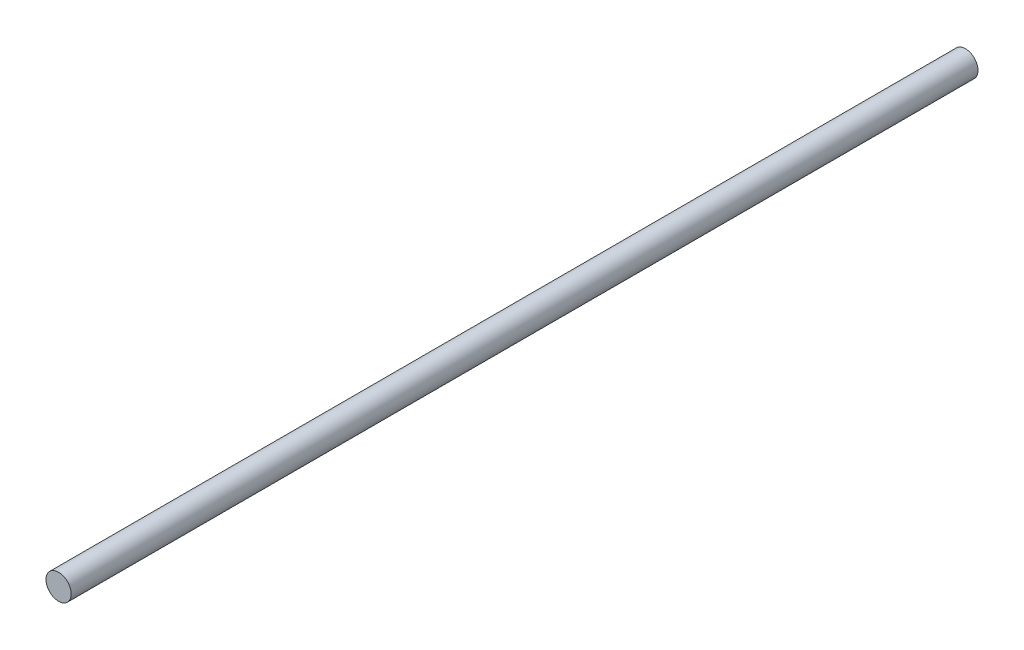
ISO-10303-21;
HEADER;
FILE_DESCRIPTION(('STEP AP214'),'2;1');
FILE_NAME('part.step','',(''),(''),'','','');
FILE_SCHEMA(('AUTOMOTIVE_DESIGN { 1 0 10303 214 1 1 1 1 }'));
ENDSEC;
DATA;
#1=APPLICATION_CONTEXT('core data for automotive mechanical design processes');
#2=APPLICATION_PROTOCOL_DEFINITION('international standard','automotive_design',2000,#1);
#3=PRODUCT_CONTEXT('',#1,'mechanical');
#4=PRODUCT('Part','Part','',(#3));
#5=PRODUCT_RELATED_PRODUCT_CATEGORY('part','',(#4));
#6=PRODUCT_DEFINITION_FORMATION('','',#4);
#7=PRODUCT_DEFINITION_CONTEXT('part definition',#1,'design');
#8=PRODUCT_DEFINITION('design','',#6,#7);
#9=PRODUCT_DEFINITION_SHAPE('','',#8);
#10=(LENGTH_UNIT() NAMED_UNIT(*) SI_UNIT(.MILLI.,.METRE.));
#11=(NAMED_UNIT(*) PLANE_ANGLE_UNIT() SI_UNIT($,.RADIAN.));
#12=(NAMED_UNIT(*) SI_UNIT($,.STERADIAN.) SOLID_ANGLE_UNIT());
#13=UNCERTAINTY_MEASURE_WITH_UNIT(LENGTH_MEASURE(1.E-05),#10,'distance_accuracy_value','');
#14=(GEOMETRIC_REPRESENTATION_CONTEXT(3) GLOBAL_UNCERTAINTY_ASSIGNED_CONTEXT((#13)) GLOBAL_UNIT_ASSIGNED_CONTEXT((#10,
#11,#12)) REPRESENTATION_CONTEXT('',''));
#15=CARTESIAN_POINT('',(0.,0.,0.));
#16=DIRECTION('',(0.,0.,1.));
#17=DIRECTION('',(1.,0.,0.));
#18=AXIS2_PLACEMENT_3D('',#15,#16,#17);
#19=CARTESIAN_POINT('',(0.,0.,114.3));
#20=DIRECTION('',(0.,0.,-1.));
#21=DIRECTION('',(-1.,0.,0.));
#22=AXIS2_PLACEMENT_3D('',#19,#20,#21);
#23=CYLINDRICAL_SURFACE('',#22,3.175);
#24=CARTESIAN_POINT('',(0.,0.,114.3));
#25=DIRECTION('',(0.,0.,1.));
#26=DIRECTION('',(1.,0.,0.));
#27=AXIS2_PLACEMENT_3D('',#24,#25,#26);
#28=CIRCLE('',#27,3.175);
#29=CARTESIAN_POINT('',(3.175,0.,114.3));
#30=VERTEX_POINT('',#29);
#31=EDGE_CURVE('E10',#30,#30,#28,.T.);
#32=ORIENTED_EDGE('',*,*,#31,.F.);
#33=EDGE_LOOP('',(#32));
#34=FACE_BOUND('',#33,.T.);
#35=CARTESIAN_POINT('',(0.,0.,-114.3));
#36=DIRECTION('',(0.,0.,1.));
#37=DIRECTION('',(1.,0.,0.));
#38=AXIS2_PLACEMENT_3D('',#35,#36,#37);
#39=CIRCLE('',#38,3.175);
#40=CARTESIAN_POINT('',(3.175,0.,-114.3));
#41=VERTEX_POINT('',#40);
#42=EDGE_CURVE('E45',#41,#41,#39,.T.);
#43=ORIENTED_EDGE('',*,*,#42,.T.);
#44=EDGE_LOOP('',(#43));
#45=FACE_BOUND('',#44,.T.);
#46=ADVANCED_FACE('F39',(#34,#45),#23,.T.);
#47=CARTESIAN_POINT('',(0.,0.,114.3));
#48=DIRECTION('',(0.,0.,1.));
#49=DIRECTION('',(1.,0.,0.));
#50=AXIS2_PLACEMENT_3D('',#47,#48,#49);
#51=PLANE('',#50);
#52=ORIENTED_EDGE('',*,*,#31,.T.);
#53=EDGE_LOOP('',(#52));
#54=FACE_BOUND('',#53,.T.);
#55=ADVANCED_FACE('F53',(#54),#51,.T.);
#56=CARTESIAN_POINT('',(0.,0.,-114.3));
#57=DIRECTION('',(0.,0.,1.));
#58=DIRECTION('',(1.,0.,0.));
#59=AXIS2_PLACEMENT_3D('',#56,#57,#58);
#60=PLANE('',#59);
#61=ORIENTED_EDGE('',*,*,#42,.F.);
#62=EDGE_LOOP('',(#61));
#63=FACE_BOUND('',#62,.T.);
#64=ADVANCED_FACE('F55',(#63),#60,.F.);
#65=CLOSED_SHELL('',(#46,#55,#64));
#66=MANIFOLD_SOLID_BREP('B2',#65);
#67=ADVANCED_BREP_SHAPE_REPRESENTATION('',(#18,#66),#14);
#68=SHAPE_DEFINITION_REPRESENTATION(#9,#67);
ENDSEC;
END-ISO-10303-21;
